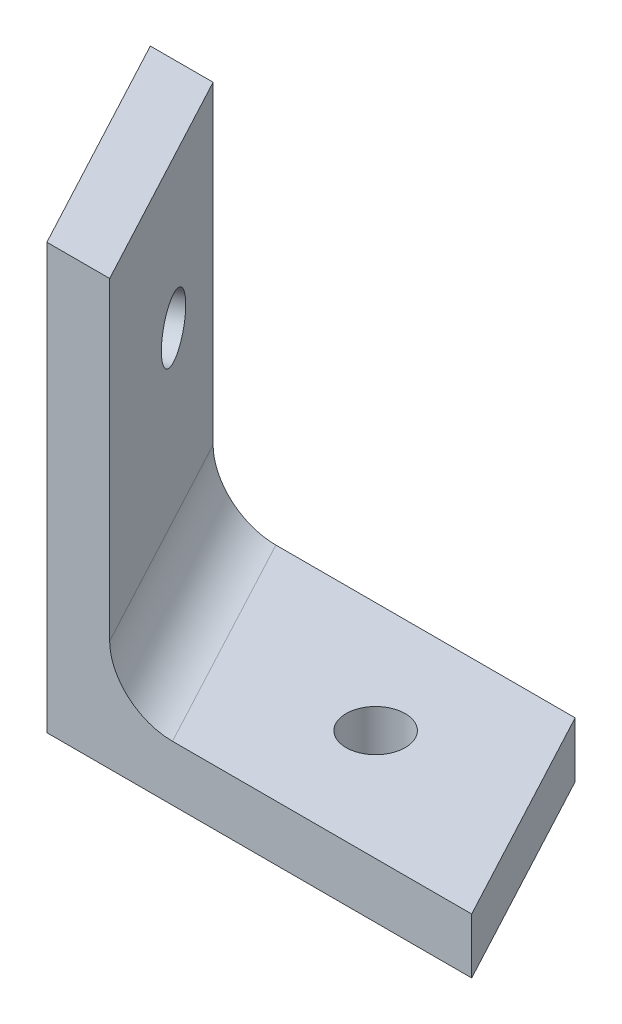
ISO-10303-21;
HEADER;
FILE_DESCRIPTION(('STEP AP214'),'2;1');
FILE_NAME('part.step','',(''),(''),'','','');
FILE_SCHEMA(('AUTOMOTIVE_DESIGN { 1 0 10303 214 1 1 1 1 }'));
ENDSEC;
DATA;
#1=APPLICATION_CONTEXT('core data for automotive mechanical design processes');
#2=APPLICATION_PROTOCOL_DEFINITION('international standard','automotive_design',2000,#1);
#3=PRODUCT_CONTEXT('',#1,'mechanical');
#4=PRODUCT('Part','Part','',(#3));
#5=PRODUCT_RELATED_PRODUCT_CATEGORY('part','',(#4));
#6=PRODUCT_DEFINITION_FORMATION('','',#4);
#7=PRODUCT_DEFINITION_CONTEXT('part definition',#1,'design');
#8=PRODUCT_DEFINITION('design','',#6,#7);
#9=PRODUCT_DEFINITION_SHAPE('','',#8);
#10=(LENGTH_UNIT() NAMED_UNIT(*) SI_UNIT(.MILLI.,.METRE.));
#11=(NAMED_UNIT(*) PLANE_ANGLE_UNIT() SI_UNIT($,.RADIAN.));
#12=(NAMED_UNIT(*) SI_UNIT($,.STERADIAN.) SOLID_ANGLE_UNIT());
#13=UNCERTAINTY_MEASURE_WITH_UNIT(LENGTH_MEASURE(1.E-05),#10,'distance_accuracy_value','');
#14=(GEOMETRIC_REPRESENTATION_CONTEXT(3) GLOBAL_UNCERTAINTY_ASSIGNED_CONTEXT((#13)) GLOBAL_UNIT_ASSIGNED_CONTEXT((#10,
#11,#12)) REPRESENTATION_CONTEXT('',''));
#15=CARTESIAN_POINT('',(0.,0.,0.));
#16=DIRECTION('',(0.,0.,1.));
#17=DIRECTION('',(1.,0.,0.));
#18=AXIS2_PLACEMENT_3D('',#15,#16,#17);
#19=CARTESIAN_POINT('',(-80.,3.,-15.));
#20=DIRECTION('',(0.88235294117647,0.,-0.470588235294119));
#21=DIRECTION('',(-0.470588235294119,0.,-0.88235294117647));
#22=AXIS2_PLACEMENT_3D('',#19,#20,#21);
#23=PLANE('',#22);
#24=CARTESIAN_POINT('',(-76.8,15.,-8.99999999999998));
#25=DIRECTION('',(0.88235294117647,0.,-0.470588235294118));
#26=DIRECTION('',(-0.470588235294118,0.,-0.88235294117647));
#27=AXIS2_PLACEMENT_3D('',#24,#25,#26);
#28=CIRCLE('',#27,1.60000000000001);
#29=CARTESIAN_POINT('',(-77.5529411764706,15.,-10.4117647058823));
#30=VERTEX_POINT('',#29);
#31=EDGE_CURVE('E276',#30,#30,#28,.T.);
#32=ORIENTED_EDGE('',*,*,#31,.T.);
#33=EDGE_LOOP('',(#32));
#34=FACE_BOUND('',#33,.T.);
#35=DIRECTION('',(0.470588235294119,0.,0.88235294117647));
#36=VECTOR('',#35,1.);
#37=CARTESIAN_POINT('',(-80.,0.,-15.));
#38=LINE('',#37,#36);
#39=CARTESIAN_POINT('',(-80.,0.,-15.));
#40=VERTEX_POINT('',#39);
#41=CARTESIAN_POINT('',(-73.6,0.,-2.99999999999998));
#42=VERTEX_POINT('',#41);
#43=EDGE_CURVE('E131',#40,#42,#38,.T.);
#44=ORIENTED_EDGE('',*,*,#43,.T.);
#45=DIRECTION('',(0.,-1.,0.));
#46=VECTOR('',#45,1.);
#47=CARTESIAN_POINT('',(-73.6,3.,-2.99999999999998));
#48=LINE('',#47,#46);
#49=CARTESIAN_POINT('',(-73.6,23.,-2.99999999999998));
#50=VERTEX_POINT('',#49);
#51=EDGE_CURVE('E108',#50,#42,#48,.T.);
#52=ORIENTED_EDGE('',*,*,#51,.F.);
#53=DIRECTION('',(0.470588235294119,0.,0.88235294117647));
#54=VECTOR('',#53,1.);
#55=CARTESIAN_POINT('',(-80.,23.,-15.));
#56=LINE('',#55,#54);
#57=CARTESIAN_POINT('',(-80.,23.,-15.));
#58=VERTEX_POINT('',#57);
#59=EDGE_CURVE('E106',#58,#50,#56,.T.);
#60=ORIENTED_EDGE('',*,*,#59,.F.);
#61=DIRECTION('',(0.,-1.,0.));
#62=VECTOR('',#61,1.);
#63=CARTESIAN_POINT('',(-80.,3.,-15.));
#64=LINE('',#63,#62);
#65=EDGE_CURVE('E91',#58,#40,#64,.T.);
#66=ORIENTED_EDGE('',*,*,#65,.T.);
#67=EDGE_LOOP('',(#44,#52,#60,#66));
#68=FACE_BOUND('',#67,.T.);
#69=ADVANCED_FACE('F34',(#34,#68),#23,.F.);
#70=CARTESIAN_POINT('',(-73.6,3.,-2.99999999999998));
#71=DIRECTION('',(0.,0.,-1.));
#72=DIRECTION('',(-1.,0.,0.));
#73=AXIS2_PLACEMENT_3D('',#70,#71,#72);
#74=PLANE('',#73);
#75=DIRECTION('',(1.,0.,0.));
#76=VECTOR('',#75,1.);
#77=CARTESIAN_POINT('',(-73.6,0.,-2.99999999999998));
#78=LINE('',#77,#76);
#79=CARTESIAN_POINT('',(-50.6,0.,-2.99999999999998));
#80=VERTEX_POINT('',#79);
#81=EDGE_CURVE('E138',#42,#80,#78,.T.);
#82=ORIENTED_EDGE('',*,*,#81,.T.);
#83=DIRECTION('',(0.,-1.,0.));
#84=VECTOR('',#83,1.);
#85=CARTESIAN_POINT('',(-50.6,3.,-2.99999999999998));
#86=LINE('',#85,#84);
#87=CARTESIAN_POINT('',(-50.6,3.,-2.99999999999998));
#88=VERTEX_POINT('',#87);
#89=EDGE_CURVE('E144',#88,#80,#86,.T.);
#90=ORIENTED_EDGE('',*,*,#89,.F.);
#91=DIRECTION('',(1.,0.,0.));
#92=VECTOR('',#91,1.);
#93=CARTESIAN_POINT('',(-73.6,3.,-2.99999999999998));
#94=LINE('',#93,#92);
#95=CARTESIAN_POINT('',(-66.8,3.,-2.99999999999998));
#96=VERTEX_POINT('',#95);
#97=EDGE_CURVE('E132',#96,#88,#94,.T.);
#98=ORIENTED_EDGE('',*,*,#97,.F.);
#99=CARTESIAN_POINT('',(-66.8,6.,-2.99999999999998));
#100=DIRECTION('',(0.,0.,-1.));
#101=DIRECTION('',(-1.,0.,0.));
#102=AXIS2_PLACEMENT_3D('',#99,#100,#101);
#103=ELLIPSE('',#102,3.4,3.);
#104=CARTESIAN_POINT('',(-70.2,6.,-2.99999999999998));
#105=VERTEX_POINT('',#104);
#106=EDGE_CURVE('E11',#96,#105,#103,.T.);
#107=ORIENTED_EDGE('',*,*,#106,.T.);
#108=DIRECTION('',(0.,-1.,0.));
#109=VECTOR('',#108,1.);
#110=CARTESIAN_POINT('',(-70.2,23.,-2.99999999999998));
#111=LINE('',#110,#109);
#112=CARTESIAN_POINT('',(-70.2,23.,-2.99999999999998));
#113=VERTEX_POINT('',#112);
#114=EDGE_CURVE('E128',#113,#105,#111,.T.);
#115=ORIENTED_EDGE('',*,*,#114,.F.);
#116=DIRECTION('',(1.,0.,0.));
#117=VECTOR('',#116,1.);
#118=CARTESIAN_POINT('',(-73.6,23.,-2.99999999999998));
#119=LINE('',#118,#117);
#120=EDGE_CURVE('E111',#50,#113,#119,.T.);
#121=ORIENTED_EDGE('',*,*,#120,.F.);
#122=ORIENTED_EDGE('',*,*,#51,.T.);
#123=EDGE_LOOP('',(#82,#90,#98,#107,#115,#121,#122));
#124=FACE_BOUND('',#123,.T.);
#125=ADVANCED_FACE('F158',(#124),#74,.F.);
#126=CARTESIAN_POINT('',(-50.6,3.,-2.99999999999998));
#127=DIRECTION('',(-0.88235294117647,0.,0.470588235294119));
#128=DIRECTION('',(0.470588235294119,0.,0.88235294117647));
#129=AXIS2_PLACEMENT_3D('',#126,#127,#128);
#130=PLANE('',#129);
#131=DIRECTION('',(-0.470588235294119,0.,-0.88235294117647));
#132=VECTOR('',#131,1.);
#133=CARTESIAN_POINT('',(-50.6,0.,-2.99999999999998));
#134=LINE('',#133,#132);
#135=CARTESIAN_POINT('',(-57.,0.,-15.));
#136=VERTEX_POINT('',#135);
#137=EDGE_CURVE('E140',#80,#136,#134,.T.);
#138=ORIENTED_EDGE('',*,*,#137,.T.);
#139=DIRECTION('',(0.,-1.,0.));
#140=VECTOR('',#139,1.);
#141=CARTESIAN_POINT('',(-57.,3.,-15.));
#142=LINE('',#141,#140);
#143=CARTESIAN_POINT('',(-57.,3.,-15.));
#144=VERTEX_POINT('',#143);
#145=EDGE_CURVE('E102',#144,#136,#142,.T.);
#146=ORIENTED_EDGE('',*,*,#145,.F.);
#147=DIRECTION('',(-0.470588235294119,0.,-0.88235294117647));
#148=VECTOR('',#147,1.);
#149=CARTESIAN_POINT('',(-50.6,3.,-2.99999999999998));
#150=LINE('',#149,#148);
#151=EDGE_CURVE('E134',#88,#144,#150,.T.);
#152=ORIENTED_EDGE('',*,*,#151,.F.);
#153=ORIENTED_EDGE('',*,*,#89,.T.);
#154=EDGE_LOOP('',(#138,#146,#152,#153));
#155=FACE_BOUND('',#154,.T.);
#156=ADVANCED_FACE('F164',(#155),#130,.F.);
#157=CARTESIAN_POINT('',(-80.,3.,-15.));
#158=DIRECTION('',(0.,0.,1.));
#159=DIRECTION('',(1.,0.,0.));
#160=AXIS2_PLACEMENT_3D('',#157,#158,#159);
#161=PLANE('',#160);
#162=DIRECTION('',(-1.,0.,0.));
#163=VECTOR('',#162,1.);
#164=CARTESIAN_POINT('',(-80.,0.,-15.));
#165=LINE('',#164,#163);
#166=EDGE_CURVE('E98',#136,#40,#165,.T.);
#167=ORIENTED_EDGE('',*,*,#166,.T.);
#168=ORIENTED_EDGE('',*,*,#65,.F.);
#169=DIRECTION('',(-1.,0.,0.));
#170=VECTOR('',#169,1.);
#171=CARTESIAN_POINT('',(-76.6,23.,-15.));
#172=LINE('',#171,#170);
#173=CARTESIAN_POINT('',(-76.6,23.,-15.));
#174=VERTEX_POINT('',#173);
#175=EDGE_CURVE('E95',#174,#58,#172,.T.);
#176=ORIENTED_EDGE('',*,*,#175,.F.);
#177=DIRECTION('',(0.,-1.,0.));
#178=VECTOR('',#177,1.);
#179=CARTESIAN_POINT('',(-76.6,23.,-15.));
#180=LINE('',#179,#178);
#181=CARTESIAN_POINT('',(-76.6,6.,-15.));
#182=VERTEX_POINT('',#181);
#183=EDGE_CURVE('E126',#174,#182,#180,.T.);
#184=ORIENTED_EDGE('',*,*,#183,.T.);
#185=CARTESIAN_POINT('',(-73.2,6.,-15.));
#186=DIRECTION('',(0.,0.,1.));
#187=DIRECTION('',(-1.,0.,0.));
#188=AXIS2_PLACEMENT_3D('',#185,#186,#187);
#189=ELLIPSE('',#188,3.4,3.);
#190=CARTESIAN_POINT('',(-73.2,3.,-15.));
#191=VERTEX_POINT('',#190);
#192=EDGE_CURVE('E42',#182,#191,#189,.T.);
#193=ORIENTED_EDGE('',*,*,#192,.T.);
#194=DIRECTION('',(-1.,0.,0.));
#195=VECTOR('',#194,1.);
#196=CARTESIAN_POINT('',(-80.,3.,-15.));
#197=LINE('',#196,#195);
#198=EDGE_CURVE('E103',#144,#191,#197,.T.);
#199=ORIENTED_EDGE('',*,*,#198,.F.);
#200=ORIENTED_EDGE('',*,*,#145,.T.);
#201=EDGE_LOOP('',(#167,#168,#176,#184,#193,#199,#200));
#202=FACE_BOUND('',#201,.T.);
#203=ADVANCED_FACE('F93',(#202),#161,.F.);
#204=CARTESIAN_POINT('',(0.,3.,0.));
#205=DIRECTION('',(0.,1.,0.));
#206=DIRECTION('',(0.,0.,1.));
#207=AXIS2_PLACEMENT_3D('',#204,#205,#206);
#208=PLANE('',#207);
#209=CARTESIAN_POINT('',(-61.8,3.,-8.99999999999998));
#210=DIRECTION('',(0.,1.,0.));
#211=DIRECTION('',(0.,0.,1.));
#212=AXIS2_PLACEMENT_3D('',#209,#210,#211);
#213=CIRCLE('',#212,1.6);
#214=CARTESIAN_POINT('',(-61.8,3.,-7.39999999999999));
#215=VERTEX_POINT('',#214);
#216=EDGE_CURVE('E117',#215,#215,#213,.T.);
#217=ORIENTED_EDGE('',*,*,#216,.F.);
#218=EDGE_LOOP('',(#217));
#219=FACE_BOUND('',#218,.T.);
#220=ORIENTED_EDGE('',*,*,#198,.T.);
#221=DIRECTION('',(-0.470588235294119,0.,-0.88235294117647));
#222=VECTOR('',#221,1.);
#223=CARTESIAN_POINT('',(-50.7612456747404,3.,27.0726643598616));
#224=LINE('',#223,#222);
#225=EDGE_CURVE('E55',#191,#96,#224,.F.);
#226=ORIENTED_EDGE('',*,*,#225,.T.);
#227=ORIENTED_EDGE('',*,*,#97,.T.);
#228=ORIENTED_EDGE('',*,*,#151,.T.);
#229=EDGE_LOOP('',(#220,#226,#227,#228));
#230=FACE_BOUND('',#229,.T.);
#231=ADVANCED_FACE('F161',(#219,#230),#208,.T.);
#232=CARTESIAN_POINT('',(0.,0.,0.));
#233=DIRECTION('',(0.,1.,0.));
#234=DIRECTION('',(0.,0.,1.));
#235=AXIS2_PLACEMENT_3D('',#232,#233,#234);
#236=PLANE('',#235);
#237=CARTESIAN_POINT('',(-61.8,0.,-8.99999999999998));
#238=DIRECTION('',(0.,1.,0.));
#239=DIRECTION('',(0.,0.,1.));
#240=AXIS2_PLACEMENT_3D('',#237,#238,#239);
#241=CIRCLE('',#240,1.6);
#242=CARTESIAN_POINT('',(-61.8,0.,-7.39999999999999));
#243=VERTEX_POINT('',#242);
#244=EDGE_CURVE('E120',#243,#243,#241,.T.);
#245=ORIENTED_EDGE('',*,*,#244,.T.);
#246=EDGE_LOOP('',(#245));
#247=FACE_BOUND('',#246,.T.);
#248=ORIENTED_EDGE('',*,*,#43,.F.);
#249=ORIENTED_EDGE('',*,*,#166,.F.);
#250=ORIENTED_EDGE('',*,*,#137,.F.);
#251=ORIENTED_EDGE('',*,*,#81,.F.);
#252=EDGE_LOOP('',(#248,#249,#250,#251));
#253=FACE_BOUND('',#252,.T.);
#254=ADVANCED_FACE('F167',(#247,#253),#236,.F.);
#255=CARTESIAN_POINT('',(-70.2,23.,-2.99999999999998));
#256=DIRECTION('',(-0.88235294117647,0.,0.470588235294119));
#257=DIRECTION('',(0.470588235294119,0.,0.88235294117647));
#258=AXIS2_PLACEMENT_3D('',#255,#256,#257);
#259=PLANE('',#258);
#260=CARTESIAN_POINT('',(-74.1529411764706,15.,-10.4117647058823));
#261=DIRECTION('',(-0.88235294117647,0.,0.470588235294119));
#262=DIRECTION('',(0.470588235294119,0.,0.88235294117647));
#263=AXIS2_PLACEMENT_3D('',#260,#261,#262);
#264=CIRCLE('',#263,1.60000000000001);
#265=CARTESIAN_POINT('',(-73.4,15.,-8.99999999999996));
#266=VERTEX_POINT('',#265);
#267=EDGE_CURVE('E277',#266,#266,#264,.T.);
#268=ORIENTED_EDGE('',*,*,#267,.T.);
#269=EDGE_LOOP('',(#268));
#270=FACE_BOUND('',#269,.T.);
#271=ORIENTED_EDGE('',*,*,#114,.T.);
#272=DIRECTION('',(-0.470588235294119,0.,-0.88235294117647));
#273=VECTOR('',#272,1.);
#274=CARTESIAN_POINT('',(-70.2,6.,-2.99999999999998));
#275=LINE('',#274,#273);
#276=EDGE_CURVE('E148',#105,#182,#275,.T.);
#277=ORIENTED_EDGE('',*,*,#276,.T.);
#278=ORIENTED_EDGE('',*,*,#183,.F.);
#279=DIRECTION('',(-0.470588235294119,0.,-0.88235294117647));
#280=VECTOR('',#279,1.);
#281=CARTESIAN_POINT('',(-70.2,23.,-2.99999999999998));
#282=LINE('',#281,#280);
#283=EDGE_CURVE('E115',#113,#174,#282,.T.);
#284=ORIENTED_EDGE('',*,*,#283,.F.);
#285=EDGE_LOOP('',(#271,#277,#278,#284));
#286=FACE_BOUND('',#285,.T.);
#287=ADVANCED_FACE('F153',(#270,#286),#259,.F.);
#288=CARTESIAN_POINT('',(0.,23.,0.));
#289=DIRECTION('',(0.,1.,0.));
#290=DIRECTION('',(0.,0.,1.));
#291=AXIS2_PLACEMENT_3D('',#288,#289,#290);
#292=PLANE('',#291);
#293=ORIENTED_EDGE('',*,*,#175,.T.);
#294=ORIENTED_EDGE('',*,*,#59,.T.);
#295=ORIENTED_EDGE('',*,*,#120,.T.);
#296=ORIENTED_EDGE('',*,*,#283,.T.);
#297=EDGE_LOOP('',(#293,#294,#295,#296));
#298=FACE_BOUND('',#297,.T.);
#299=ADVANCED_FACE('F113',(#298),#292,.T.);
#300=CARTESIAN_POINT('',(-61.8,23.001,-8.99999999999998));
#301=DIRECTION('',(0.,-1.,0.));
#302=DIRECTION('',(0.,0.,-1.));
#303=AXIS2_PLACEMENT_3D('',#300,#301,#302);
#304=CYLINDRICAL_SURFACE('',#303,1.6);
#305=ORIENTED_EDGE('',*,*,#216,.T.);
#306=EDGE_LOOP('',(#305));
#307=FACE_BOUND('',#306,.T.);
#308=ORIENTED_EDGE('',*,*,#244,.F.);
#309=EDGE_LOOP('',(#308));
#310=FACE_BOUND('',#309,.T.);
#311=ADVANCED_FACE('F227',(#307,#310),#304,.F.);
#312=CARTESIAN_POINT('',(-53.9095328719723,15.,-21.2082491349481));
#313=DIRECTION('',(-0.88235294117647,0.,0.470588235294118));
#314=DIRECTION('',(0.470588235294118,0.,0.88235294117647));
#315=AXIS2_PLACEMENT_3D('',#312,#313,#314);
#316=CYLINDRICAL_SURFACE('',#315,1.60000000000001);
#317=ORIENTED_EDGE('',*,*,#31,.F.);
#318=EDGE_LOOP('',(#317));
#319=FACE_BOUND('',#318,.T.);
#320=ORIENTED_EDGE('',*,*,#267,.F.);
#321=EDGE_LOOP('',(#320));
#322=FACE_BOUND('',#321,.T.);
#323=ADVANCED_FACE('F218',(#319,#322),#316,.F.);
#324=CARTESIAN_POINT('',(-67.5529411764706,6.,-4.41176470588234));
#325=DIRECTION('',(-0.470588235294119,0.,-0.88235294117647));
#326=DIRECTION('',(-0.88235294117647,0.,0.470588235294119));
#327=AXIS2_PLACEMENT_3D('',#324,#325,#326);
#328=CYLINDRICAL_SURFACE('',#327,3.);
#329=ORIENTED_EDGE('',*,*,#106,.F.);
#330=ORIENTED_EDGE('',*,*,#225,.F.);
#331=ORIENTED_EDGE('',*,*,#192,.F.);
#332=ORIENTED_EDGE('',*,*,#276,.F.);
#333=EDGE_LOOP('',(#329,#330,#331,#332));
#334=FACE_BOUND('',#333,.T.);
#335=ADVANCED_FACE('F36',(#334),#328,.F.);
#336=CLOSED_SHELL('',(#69,#125,#156,#203,#231,#254,#287,#299,#311,#323,#335));
#337=MANIFOLD_SOLID_BREP('B2',#336);
#338=ADVANCED_BREP_SHAPE_REPRESENTATION('',(#18,#337),#14);
#339=SHAPE_DEFINITION_REPRESENTATION(#9,#338);
ENDSEC;
END-ISO-10303-21;
